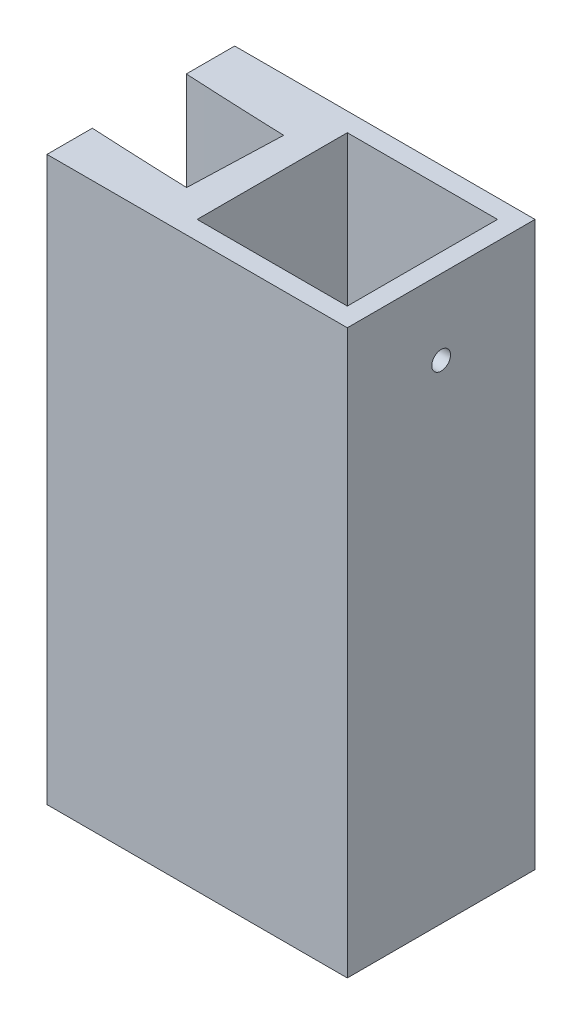
ISO-10303-21;
HEADER;
FILE_DESCRIPTION(('STEP AP214'),'2;1');
FILE_NAME('part.step','',(''),(''),'','','');
FILE_SCHEMA(('AUTOMOTIVE_DESIGN { 1 0 10303 214 1 1 1 1 }'));
ENDSEC;
DATA;
#1=APPLICATION_CONTEXT('core data for automotive mechanical design processes');
#2=APPLICATION_PROTOCOL_DEFINITION('international standard','automotive_design',2000,#1);
#3=PRODUCT_CONTEXT('',#1,'mechanical');
#4=PRODUCT('Part','Part','',(#3));
#5=PRODUCT_RELATED_PRODUCT_CATEGORY('part','',(#4));
#6=PRODUCT_DEFINITION_FORMATION('','',#4);
#7=PRODUCT_DEFINITION_CONTEXT('part definition',#1,'design');
#8=PRODUCT_DEFINITION('design','',#6,#7);
#9=PRODUCT_DEFINITION_SHAPE('','',#8);
#10=(LENGTH_UNIT() NAMED_UNIT(*) SI_UNIT(.MILLI.,.METRE.));
#11=(NAMED_UNIT(*) PLANE_ANGLE_UNIT() SI_UNIT($,.RADIAN.));
#12=(NAMED_UNIT(*) SI_UNIT($,.STERADIAN.) SOLID_ANGLE_UNIT());
#13=UNCERTAINTY_MEASURE_WITH_UNIT(LENGTH_MEASURE(1.E-05),#10,'distance_accuracy_value','');
#14=(GEOMETRIC_REPRESENTATION_CONTEXT(3) GLOBAL_UNCERTAINTY_ASSIGNED_CONTEXT((#13)) GLOBAL_UNIT_ASSIGNED_CONTEXT((#10,
#11,#12)) REPRESENTATION_CONTEXT('',''));
#15=CARTESIAN_POINT('',(0.,0.,0.));
#16=DIRECTION('',(0.,0.,1.));
#17=DIRECTION('',(1.,0.,0.));
#18=AXIS2_PLACEMENT_3D('',#15,#16,#17);
#19=CARTESIAN_POINT('',(-55.,150.,0.));
#20=DIRECTION('',(1.,0.,0.));
#21=DIRECTION('',(0.,0.,-1.));
#22=AXIS2_PLACEMENT_3D('',#19,#20,#21);
#23=PLANE('',#22);
#24=DIRECTION('',(0.,0.,1.));
#25=VECTOR('',#24,1.);
#26=CARTESIAN_POINT('',(-55.,0.,0.));
#27=LINE('',#26,#25);
#28=CARTESIAN_POINT('',(-55.,0.,-25.));
#29=VERTEX_POINT('',#28);
#30=CARTESIAN_POINT('',(-55.,0.,-12.1136856987565));
#31=VERTEX_POINT('',#30);
#32=EDGE_CURVE('E134',#29,#31,#27,.T.);
#33=ORIENTED_EDGE('',*,*,#32,.T.);
#34=DIRECTION('',(0.,1.,0.));
#35=VECTOR('',#34,1.);
#36=CARTESIAN_POINT('',(-55.,-0.001000000000001,-12.1136856987565));
#37=LINE('',#36,#35);
#38=CARTESIAN_POINT('',(-55.,150.,-12.1136856987565));
#39=VERTEX_POINT('',#38);
#40=EDGE_CURVE('E141',#31,#39,#37,.T.);
#41=ORIENTED_EDGE('',*,*,#40,.T.);
#42=DIRECTION('',(0.,0.,1.));
#43=VECTOR('',#42,1.);
#44=CARTESIAN_POINT('',(-55.,150.,0.));
#45=LINE('',#44,#43);
#46=CARTESIAN_POINT('',(-55.,150.,-25.));
#47=VERTEX_POINT('',#46);
#48=EDGE_CURVE('E166',#47,#39,#45,.T.);
#49=ORIENTED_EDGE('',*,*,#48,.F.);
#50=DIRECTION('',(0.,-1.,0.));
#51=VECTOR('',#50,1.);
#52=CARTESIAN_POINT('',(-55.,150.,-25.));
#53=LINE('',#52,#51);
#54=EDGE_CURVE('E152',#47,#29,#53,.T.);
#55=ORIENTED_EDGE('',*,*,#54,.T.);
#56=EDGE_LOOP('',(#33,#41,#49,#55));
#57=FACE_BOUND('',#56,.T.);
#58=ADVANCED_FACE('F39',(#57),#23,.F.);
#59=CARTESIAN_POINT('',(0.,150.,25.));
#60=DIRECTION('',(0.,0.,1.));
#61=DIRECTION('',(1.,0.,0.));
#62=AXIS2_PLACEMENT_3D('',#59,#60,#61);
#63=PLANE('',#62);
#64=DIRECTION('',(-1.,0.,0.));
#65=VECTOR('',#64,1.);
#66=CARTESIAN_POINT('',(0.,0.,25.));
#67=LINE('',#66,#65);
#68=CARTESIAN_POINT('',(25.,0.,25.));
#69=VERTEX_POINT('',#68);
#70=CARTESIAN_POINT('',(-55.,0.,25.));
#71=VERTEX_POINT('',#70);
#72=EDGE_CURVE('E180',#69,#71,#67,.T.);
#73=ORIENTED_EDGE('',*,*,#72,.F.);
#74=DIRECTION('',(0.,-1.,0.));
#75=VECTOR('',#74,1.);
#76=CARTESIAN_POINT('',(25.,150.,25.));
#77=LINE('',#76,#75);
#78=CARTESIAN_POINT('',(25.,150.,25.));
#79=VERTEX_POINT('',#78);
#80=EDGE_CURVE('E11',#79,#69,#77,.T.);
#81=ORIENTED_EDGE('',*,*,#80,.F.);
#82=DIRECTION('',(-1.,0.,0.));
#83=VECTOR('',#82,1.);
#84=CARTESIAN_POINT('',(0.,150.,25.));
#85=LINE('',#84,#83);
#86=CARTESIAN_POINT('',(-55.,150.,25.));
#87=VERTEX_POINT('',#86);
#88=EDGE_CURVE('E153',#79,#87,#85,.T.);
#89=ORIENTED_EDGE('',*,*,#88,.T.);
#90=DIRECTION('',(0.,-1.,0.));
#91=VECTOR('',#90,1.);
#92=CARTESIAN_POINT('',(-55.,150.,25.));
#93=LINE('',#92,#91);
#94=EDGE_CURVE('E163',#87,#71,#93,.T.);
#95=ORIENTED_EDGE('',*,*,#94,.T.);
#96=EDGE_LOOP('',(#73,#81,#89,#95));
#97=FACE_BOUND('',#96,.T.);
#98=ADVANCED_FACE('F41',(#97),#63,.T.);
#99=CARTESIAN_POINT('',(25.,150.,0.));
#100=DIRECTION('',(1.,0.,0.));
#101=DIRECTION('',(0.,0.,-1.));
#102=AXIS2_PLACEMENT_3D('',#99,#100,#101);
#103=PLANE('',#102);
#104=CARTESIAN_POINT('',(25.,130.,0.));
#105=DIRECTION('',(1.,0.,0.));
#106=DIRECTION('',(0.,0.,-1.));
#107=AXIS2_PLACEMENT_3D('',#104,#105,#106);
#108=CIRCLE('',#107,2.5);
#109=CARTESIAN_POINT('',(25.,130.,-2.50000000000001));
#110=VERTEX_POINT('',#109);
#111=EDGE_CURVE('E226',#110,#110,#108,.T.);
#112=ORIENTED_EDGE('',*,*,#111,.F.);
#113=EDGE_LOOP('',(#112));
#114=FACE_BOUND('',#113,.T.);
#115=DIRECTION('',(0.,0.,1.));
#116=VECTOR('',#115,1.);
#117=CARTESIAN_POINT('',(25.,0.,0.));
#118=LINE('',#117,#116);
#119=CARTESIAN_POINT('',(25.,0.,-25.));
#120=VERTEX_POINT('',#119);
#121=EDGE_CURVE('E175',#120,#69,#118,.T.);
#122=ORIENTED_EDGE('',*,*,#121,.F.);
#123=DIRECTION('',(0.,-1.,0.));
#124=VECTOR('',#123,1.);
#125=CARTESIAN_POINT('',(25.,150.,-25.));
#126=LINE('',#125,#124);
#127=CARTESIAN_POINT('',(25.,150.,-25.));
#128=VERTEX_POINT('',#127);
#129=EDGE_CURVE('E47',#128,#120,#126,.T.);
#130=ORIENTED_EDGE('',*,*,#129,.F.);
#131=DIRECTION('',(0.,0.,1.));
#132=VECTOR('',#131,1.);
#133=CARTESIAN_POINT('',(25.,150.,0.));
#134=LINE('',#133,#132);
#135=EDGE_CURVE('E157',#128,#79,#134,.T.);
#136=ORIENTED_EDGE('',*,*,#135,.T.);
#137=ORIENTED_EDGE('',*,*,#80,.T.);
#138=EDGE_LOOP('',(#122,#130,#136,#137));
#139=FACE_BOUND('',#138,.T.);
#140=ADVANCED_FACE('F176',(#114,#139),#103,.T.);
#141=CARTESIAN_POINT('',(0.,150.,-25.));
#142=DIRECTION('',(0.,0.,1.));
#143=DIRECTION('',(1.,0.,0.));
#144=AXIS2_PLACEMENT_3D('',#141,#142,#143);
#145=PLANE('',#144);
#146=DIRECTION('',(-1.,0.,0.));
#147=VECTOR('',#146,1.);
#148=CARTESIAN_POINT('',(0.,0.,-25.));
#149=LINE('',#148,#147);
#150=EDGE_CURVE('E159',#120,#29,#149,.T.);
#151=ORIENTED_EDGE('',*,*,#150,.T.);
#152=ORIENTED_EDGE('',*,*,#54,.F.);
#153=DIRECTION('',(-1.,0.,0.));
#154=VECTOR('',#153,1.);
#155=CARTESIAN_POINT('',(0.,150.,-25.));
#156=LINE('',#155,#154);
#157=EDGE_CURVE('E172',#128,#47,#156,.T.);
#158=ORIENTED_EDGE('',*,*,#157,.F.);
#159=ORIENTED_EDGE('',*,*,#129,.T.);
#160=EDGE_LOOP('',(#151,#152,#158,#159));
#161=FACE_BOUND('',#160,.T.);
#162=ADVANCED_FACE('F171',(#161),#145,.F.);
#163=CARTESIAN_POINT('',(-55.0000000000003,150.,12.9206741571568));
#164=VERTEX_POINT('',#163);
#165=EDGE_CURVE('E185',#164,#87,#45,.T.);
#166=ORIENTED_EDGE('',*,*,#165,.F.);
#167=DIRECTION('',(0.,1.,0.));
#168=VECTOR('',#167,1.);
#169=CARTESIAN_POINT('',(-55.0000000000003,-0.001000000000001,12.9206741571568));
#170=LINE('',#169,#168);
#171=CARTESIAN_POINT('',(-55.0000000000003,0.,12.9206741571568));
#172=VERTEX_POINT('',#171);
#173=EDGE_CURVE('E147',#172,#164,#170,.T.);
#174=ORIENTED_EDGE('',*,*,#173,.F.);
#175=EDGE_CURVE('E154',#172,#71,#27,.T.);
#176=ORIENTED_EDGE('',*,*,#175,.T.);
#177=ORIENTED_EDGE('',*,*,#94,.F.);
#178=EDGE_LOOP('',(#166,#174,#176,#177));
#179=FACE_BOUND('',#178,.T.);
#180=ADVANCED_FACE('F247',(#179),#23,.F.);
#181=CARTESIAN_POINT('',(0.,150.,0.));
#182=DIRECTION('',(0.,1.,0.));
#183=DIRECTION('',(0.,0.,1.));
#184=AXIS2_PLACEMENT_3D('',#181,#182,#183);
#185=PLANE('',#184);
#186=CARTESIAN_POINT('',(24.999999999988,150.,-1525.));
#187=DIRECTION('',(0.,-1.,0.));
#188=DIRECTION('',(0.,0.,1.));
#189=AXIS2_PLACEMENT_3D('',#186,#187,#188);
#190=CIRCLE('',#189,1515.);
#191=CARTESIAN_POINT('',(-27.8727375043363,150.,-10.9228970660713));
#192=VERTEX_POINT('',#191);
#193=EDGE_CURVE('E138',#192,#39,#190,.T.);
#194=ORIENTED_EDGE('',*,*,#193,.F.);
#195=DIRECTION('',(0.0348994967025245,0.,-0.999390827019095));
#196=VECTOR('',#195,1.);
#197=CARTESIAN_POINT('',(-28.7452249218995,150.,14.0618736094071));
#198=LINE('',#197,#196);
#199=CARTESIAN_POINT('',(-28.7452249218995,150.,14.0618736094071));
#200=VERTEX_POINT('',#199);
#201=EDGE_CURVE('E148',#200,#192,#198,.T.);
#202=ORIENTED_EDGE('',*,*,#201,.F.);
#203=CARTESIAN_POINT('',(24.999999999988,150.,-1525.));
#204=DIRECTION('',(0.,1.,0.));
#205=DIRECTION('',(0.,0.,1.));
#206=AXIS2_PLACEMENT_3D('',#203,#204,#205);
#207=CIRCLE('',#206,1540.);
#208=EDGE_CURVE('E236',#164,#200,#207,.T.);
#209=ORIENTED_EDGE('',*,*,#208,.F.);
#210=ORIENTED_EDGE('',*,*,#165,.T.);
#211=ORIENTED_EDGE('',*,*,#88,.F.);
#212=ORIENTED_EDGE('',*,*,#135,.F.);
#213=ORIENTED_EDGE('',*,*,#157,.T.);
#214=ORIENTED_EDGE('',*,*,#48,.T.);
#215=EDGE_LOOP('',(#194,#202,#209,#210,#211,#212,#213,#214));
#216=FACE_BOUND('',#215,.T.);
#217=DIRECTION('',(0.,0.,-1.));
#218=VECTOR('',#217,1.);
#219=CARTESIAN_POINT('',(20.,150.,-20.));
#220=LINE('',#219,#218);
#221=CARTESIAN_POINT('',(20.,150.,20.));
#222=VERTEX_POINT('',#221);
#223=CARTESIAN_POINT('',(20.,150.,-20.));
#224=VERTEX_POINT('',#223);
#225=EDGE_CURVE('E213',#222,#224,#220,.T.);
#226=ORIENTED_EDGE('',*,*,#225,.F.);
#227=DIRECTION('',(1.,0.,0.));
#228=VECTOR('',#227,1.);
#229=CARTESIAN_POINT('',(-20.,150.,20.));
#230=LINE('',#229,#228);
#231=CARTESIAN_POINT('',(-20.,150.,20.));
#232=VERTEX_POINT('',#231);
#233=EDGE_CURVE('E204',#232,#222,#230,.T.);
#234=ORIENTED_EDGE('',*,*,#233,.F.);
#235=DIRECTION('',(0.,0.,1.));
#236=VECTOR('',#235,1.);
#237=CARTESIAN_POINT('',(-20.,150.,-20.));
#238=LINE('',#237,#236);
#239=CARTESIAN_POINT('',(-20.,150.,-20.));
#240=VERTEX_POINT('',#239);
#241=EDGE_CURVE('E208',#240,#232,#238,.T.);
#242=ORIENTED_EDGE('',*,*,#241,.F.);
#243=DIRECTION('',(-1.,0.,0.));
#244=VECTOR('',#243,1.);
#245=CARTESIAN_POINT('',(-20.,150.,-20.));
#246=LINE('',#245,#244);
#247=EDGE_CURVE('E211',#224,#240,#246,.T.);
#248=ORIENTED_EDGE('',*,*,#247,.F.);
#249=EDGE_LOOP('',(#226,#234,#242,#248));
#250=FACE_BOUND('',#249,.T.);
#251=ADVANCED_FACE('F250',(#216,#250),#185,.T.);
#252=CARTESIAN_POINT('',(0.,0.,0.));
#253=DIRECTION('',(0.,1.,0.));
#254=DIRECTION('',(0.,0.,1.));
#255=AXIS2_PLACEMENT_3D('',#252,#253,#254);
#256=PLANE('',#255);
#257=CARTESIAN_POINT('',(0.,0.,0.));
#258=DIRECTION('',(0.,-1.,0.));
#259=DIRECTION('',(0.,0.,-1.));
#260=AXIS2_PLACEMENT_3D('',#257,#258,#259);
#261=CIRCLE('',#260,13.6824088833462);
#262=CARTESIAN_POINT('',(0.,0.,-13.6824088833462));
#263=VERTEX_POINT('',#262);
#264=EDGE_CURVE('E193',#263,#263,#261,.T.);
#265=ORIENTED_EDGE('',*,*,#264,.F.);
#266=EDGE_LOOP('',(#265));
#267=FACE_BOUND('',#266,.T.);
#268=DIRECTION('',(-0.0348994967025245,0.,0.999390827019095));
#269=VECTOR('',#268,1.);
#270=CARTESIAN_POINT('',(-28.7452249218995,0.,14.0618736094071));
#271=LINE('',#270,#269);
#272=CARTESIAN_POINT('',(-27.8727375043363,0.,-10.9228970660713));
#273=VERTEX_POINT('',#272);
#274=CARTESIAN_POINT('',(-28.7452249218995,0.,14.0618736094067));
#275=VERTEX_POINT('',#274);
#276=EDGE_CURVE('E136',#273,#275,#271,.T.);
#277=ORIENTED_EDGE('',*,*,#276,.F.);
#278=CARTESIAN_POINT('',(24.999999999988,0.,-1525.));
#279=DIRECTION('',(0.,1.,0.));
#280=DIRECTION('',(0.,0.,1.));
#281=AXIS2_PLACEMENT_3D('',#278,#279,#280);
#282=CIRCLE('',#281,1515.);
#283=EDGE_CURVE('E130',#31,#273,#282,.T.);
#284=ORIENTED_EDGE('',*,*,#283,.F.);
#285=ORIENTED_EDGE('',*,*,#32,.F.);
#286=ORIENTED_EDGE('',*,*,#150,.F.);
#287=ORIENTED_EDGE('',*,*,#121,.T.);
#288=ORIENTED_EDGE('',*,*,#72,.T.);
#289=ORIENTED_EDGE('',*,*,#175,.F.);
#290=CARTESIAN_POINT('',(24.999999999988,0.,-1525.));
#291=DIRECTION('',(0.,1.,0.));
#292=DIRECTION('',(0.,0.,1.));
#293=AXIS2_PLACEMENT_3D('',#290,#291,#292);
#294=CIRCLE('',#293,1540.);
#295=EDGE_CURVE('E240',#275,#172,#294,.F.);
#296=ORIENTED_EDGE('',*,*,#295,.F.);
#297=EDGE_LOOP('',(#277,#284,#285,#286,#287,#288,#289,#296));
#298=FACE_BOUND('',#297,.T.);
#299=ADVANCED_FACE('F132',(#267,#298),#256,.F.);
#300=CARTESIAN_POINT('',(0.,100.,0.));
#301=DIRECTION('',(0.,-1.,0.));
#302=DIRECTION('',(0.,0.,-1.));
#303=AXIS2_PLACEMENT_3D('',#300,#301,#302);
#304=PLANE('',#303);
#305=CARTESIAN_POINT('',(0.,100.,0.));
#306=DIRECTION('',(0.,-1.,0.));
#307=DIRECTION('',(0.,0.,-1.));
#308=AXIS2_PLACEMENT_3D('',#305,#306,#307);
#309=CIRCLE('',#308,5.);
#310=CARTESIAN_POINT('',(0.,100.,-5.));
#311=VERTEX_POINT('',#310);
#312=EDGE_CURVE('E181',#311,#311,#309,.T.);
#313=ORIENTED_EDGE('',*,*,#312,.T.);
#314=EDGE_LOOP('',(#313));
#315=FACE_BOUND('',#314,.T.);
#316=ADVANCED_FACE('F319',(#315),#304,.T.);
#317=CARTESIAN_POINT('',(0.,100.,0.));
#318=DIRECTION('',(0.,-1.,0.));
#319=DIRECTION('',(0.,0.,-1.));
#320=AXIS2_PLACEMENT_3D('',#317,#318,#319);
#321=CONICAL_SURFACE('',#320,5.,0.174532925199426);
#322=CARTESIAN_POINT('',(0.,50.7596123493895,0.));
#323=DIRECTION('',(0.,-1.,0.));
#324=DIRECTION('',(0.,0.,-1.));
#325=AXIS2_PLACEMENT_3D('',#322,#323,#324);
#326=CIRCLE('',#325,13.6824088833462);
#327=CARTESIAN_POINT('',(0.,50.7596123493895,-13.6824088833462));
#328=VERTEX_POINT('',#327);
#329=EDGE_CURVE('E190',#328,#328,#326,.T.);
#330=ORIENTED_EDGE('',*,*,#329,.T.);
#331=EDGE_LOOP('',(#330));
#332=FACE_BOUND('',#331,.T.);
#333=ORIENTED_EDGE('',*,*,#312,.F.);
#334=EDGE_LOOP('',(#333));
#335=FACE_BOUND('',#334,.T.);
#336=ADVANCED_FACE('F315',(#332,#335),#321,.F.);
#337=CARTESIAN_POINT('',(0.,0.,0.));
#338=DIRECTION('',(0.,-1.,0.));
#339=DIRECTION('',(0.,0.,-1.));
#340=AXIS2_PLACEMENT_3D('',#337,#338,#339);
#341=CYLINDRICAL_SURFACE('',#340,13.6824088833462);
#342=ORIENTED_EDGE('',*,*,#264,.T.);
#343=EDGE_LOOP('',(#342));
#344=FACE_BOUND('',#343,.T.);
#345=ORIENTED_EDGE('',*,*,#329,.F.);
#346=EDGE_LOOP('',(#345));
#347=FACE_BOUND('',#346,.T.);
#348=ADVANCED_FACE('F311',(#344,#347),#341,.F.);
#349=CARTESIAN_POINT('',(20.,110.,-20.));
#350=DIRECTION('',(1.,0.,0.));
#351=DIRECTION('',(0.,0.,-1.));
#352=AXIS2_PLACEMENT_3D('',#349,#350,#351);
#353=PLANE('',#352);
#354=CARTESIAN_POINT('',(20.,130.,0.));
#355=DIRECTION('',(1.,0.,0.));
#356=DIRECTION('',(0.,0.,-1.));
#357=AXIS2_PLACEMENT_3D('',#354,#355,#356);
#358=CIRCLE('',#357,2.5);
#359=CARTESIAN_POINT('',(20.,130.,-2.5));
#360=VERTEX_POINT('',#359);
#361=EDGE_CURVE('E216',#360,#360,#358,.T.);
#362=ORIENTED_EDGE('',*,*,#361,.T.);
#363=EDGE_LOOP('',(#362));
#364=FACE_BOUND('',#363,.T.);
#365=ORIENTED_EDGE('',*,*,#225,.T.);
#366=DIRECTION('',(0.,1.,0.));
#367=VECTOR('',#366,1.);
#368=CARTESIAN_POINT('',(20.,110.,-20.));
#369=LINE('',#368,#367);
#370=CARTESIAN_POINT('',(20.,110.,-20.));
#371=VERTEX_POINT('',#370);
#372=EDGE_CURVE('E62',#371,#224,#369,.T.);
#373=ORIENTED_EDGE('',*,*,#372,.F.);
#374=DIRECTION('',(0.,0.,-1.));
#375=VECTOR('',#374,1.);
#376=CARTESIAN_POINT('',(20.,110.,-20.));
#377=LINE('',#376,#375);
#378=CARTESIAN_POINT('',(20.,110.,20.));
#379=VERTEX_POINT('',#378);
#380=EDGE_CURVE('E207',#379,#371,#377,.T.);
#381=ORIENTED_EDGE('',*,*,#380,.F.);
#382=DIRECTION('',(0.,1.,0.));
#383=VECTOR('',#382,1.);
#384=CARTESIAN_POINT('',(20.,110.,20.));
#385=LINE('',#384,#383);
#386=EDGE_CURVE('E196',#379,#222,#385,.T.);
#387=ORIENTED_EDGE('',*,*,#386,.T.);
#388=EDGE_LOOP('',(#365,#373,#381,#387));
#389=FACE_BOUND('',#388,.T.);
#390=ADVANCED_FACE('F302',(#364,#389),#353,.F.);
#391=CARTESIAN_POINT('',(-20.,110.,20.));
#392=DIRECTION('',(0.,0.,1.));
#393=DIRECTION('',(1.,0.,0.));
#394=AXIS2_PLACEMENT_3D('',#391,#392,#393);
#395=PLANE('',#394);
#396=ORIENTED_EDGE('',*,*,#233,.T.);
#397=ORIENTED_EDGE('',*,*,#386,.F.);
#398=DIRECTION('',(1.,0.,0.));
#399=VECTOR('',#398,1.);
#400=CARTESIAN_POINT('',(-20.,110.,20.));
#401=LINE('',#400,#399);
#402=CARTESIAN_POINT('',(-20.,110.,20.));
#403=VERTEX_POINT('',#402);
#404=EDGE_CURVE('E199',#403,#379,#401,.T.);
#405=ORIENTED_EDGE('',*,*,#404,.F.);
#406=DIRECTION('',(0.,1.,0.));
#407=VECTOR('',#406,1.);
#408=CARTESIAN_POINT('',(-20.,110.,20.));
#409=LINE('',#408,#407);
#410=EDGE_CURVE('E201',#403,#232,#409,.T.);
#411=ORIENTED_EDGE('',*,*,#410,.T.);
#412=EDGE_LOOP('',(#396,#397,#405,#411));
#413=FACE_BOUND('',#412,.T.);
#414=ADVANCED_FACE('F298',(#413),#395,.F.);
#415=CARTESIAN_POINT('',(-20.,110.,-20.));
#416=DIRECTION('',(-1.,0.,0.));
#417=DIRECTION('',(0.,0.,1.));
#418=AXIS2_PLACEMENT_3D('',#415,#416,#417);
#419=PLANE('',#418);
#420=ORIENTED_EDGE('',*,*,#241,.T.);
#421=ORIENTED_EDGE('',*,*,#410,.F.);
#422=DIRECTION('',(0.,0.,1.));
#423=VECTOR('',#422,1.);
#424=CARTESIAN_POINT('',(-20.,110.,-20.));
#425=LINE('',#424,#423);
#426=CARTESIAN_POINT('',(-20.,110.,-20.));
#427=VERTEX_POINT('',#426);
#428=EDGE_CURVE('E218',#427,#403,#425,.T.);
#429=ORIENTED_EDGE('',*,*,#428,.F.);
#430=DIRECTION('',(0.,1.,0.));
#431=VECTOR('',#430,1.);
#432=CARTESIAN_POINT('',(-20.,110.,-20.));
#433=LINE('',#432,#431);
#434=EDGE_CURVE('E198',#427,#240,#433,.T.);
#435=ORIENTED_EDGE('',*,*,#434,.T.);
#436=EDGE_LOOP('',(#420,#421,#429,#435));
#437=FACE_BOUND('',#436,.T.);
#438=ADVANCED_FACE('F301',(#437),#419,.F.);
#439=CARTESIAN_POINT('',(-20.,110.,-20.));
#440=DIRECTION('',(0.,0.,-1.));
#441=DIRECTION('',(-1.,0.,0.));
#442=AXIS2_PLACEMENT_3D('',#439,#440,#441);
#443=PLANE('',#442);
#444=ORIENTED_EDGE('',*,*,#247,.T.);
#445=ORIENTED_EDGE('',*,*,#434,.F.);
#446=DIRECTION('',(-1.,0.,0.));
#447=VECTOR('',#446,1.);
#448=CARTESIAN_POINT('',(-20.,110.,-20.));
#449=LINE('',#448,#447);
#450=EDGE_CURVE('E220',#371,#427,#449,.T.);
#451=ORIENTED_EDGE('',*,*,#450,.F.);
#452=ORIENTED_EDGE('',*,*,#372,.T.);
#453=EDGE_LOOP('',(#444,#445,#451,#452));
#454=FACE_BOUND('',#453,.T.);
#455=ADVANCED_FACE('F293',(#454),#443,.F.);
#456=CARTESIAN_POINT('',(0.,110.,0.));
#457=DIRECTION('',(0.,1.,0.));
#458=DIRECTION('',(0.,0.,1.));
#459=AXIS2_PLACEMENT_3D('',#456,#457,#458);
#460=PLANE('',#459);
#461=ORIENTED_EDGE('',*,*,#380,.T.);
#462=ORIENTED_EDGE('',*,*,#450,.T.);
#463=ORIENTED_EDGE('',*,*,#428,.T.);
#464=ORIENTED_EDGE('',*,*,#404,.T.);
#465=EDGE_LOOP('',(#461,#462,#463,#464));
#466=FACE_BOUND('',#465,.T.);
#467=ADVANCED_FACE('F287',(#466),#460,.T.);
#468=CARTESIAN_POINT('',(25.,130.,0.));
#469=DIRECTION('',(1.,0.,0.));
#470=DIRECTION('',(0.,0.,-1.));
#471=AXIS2_PLACEMENT_3D('',#468,#469,#470);
#472=CYLINDRICAL_SURFACE('',#471,2.5);
#473=ORIENTED_EDGE('',*,*,#361,.F.);
#474=EDGE_LOOP('',(#473));
#475=FACE_BOUND('',#474,.T.);
#476=ORIENTED_EDGE('',*,*,#111,.T.);
#477=EDGE_LOOP('',(#476));
#478=FACE_BOUND('',#477,.T.);
#479=ADVANCED_FACE('F262',(#475,#478),#472,.F.);
#480=CARTESIAN_POINT('',(24.999999999988,-0.001000000000001,-1525.));
#481=DIRECTION('',(0.,1.,0.));
#482=DIRECTION('',(0.,0.,1.));
#483=AXIS2_PLACEMENT_3D('',#480,#481,#482);
#484=CYLINDRICAL_SURFACE('',#483,1515.);
#485=ORIENTED_EDGE('',*,*,#283,.T.);
#486=DIRECTION('',(0.,1.,0.));
#487=VECTOR('',#486,1.);
#488=CARTESIAN_POINT('',(-27.8727375043363,-0.001000000000001,-10.9228970660713));
#489=LINE('',#488,#487);
#490=EDGE_CURVE('E228',#273,#192,#489,.T.);
#491=ORIENTED_EDGE('',*,*,#490,.T.);
#492=ORIENTED_EDGE('',*,*,#193,.T.);
#493=ORIENTED_EDGE('',*,*,#40,.F.);
#494=EDGE_LOOP('',(#485,#491,#492,#493));
#495=FACE_BOUND('',#494,.T.);
#496=ADVANCED_FACE('F142',(#495),#484,.T.);
#497=CARTESIAN_POINT('',(-28.7452249218995,-0.001000000000001,14.0618736094071));
#498=DIRECTION('',(0.999390827019095,0.,0.0348994967025245));
#499=DIRECTION('',(0.0348994967025245,0.,-0.999390827019095));
#500=AXIS2_PLACEMENT_3D('',#497,#498,#499);
#501=PLANE('',#500);
#502=ORIENTED_EDGE('',*,*,#276,.T.);
#503=DIRECTION('',(0.,1.,0.));
#504=VECTOR('',#503,1.);
#505=CARTESIAN_POINT('',(-28.7452249218995,-0.001000000000001,14.0618736094071));
#506=LINE('',#505,#504);
#507=EDGE_CURVE('E54',#275,#200,#506,.T.);
#508=ORIENTED_EDGE('',*,*,#507,.T.);
#509=ORIENTED_EDGE('',*,*,#201,.T.);
#510=ORIENTED_EDGE('',*,*,#490,.F.);
#511=EDGE_LOOP('',(#502,#508,#509,#510));
#512=FACE_BOUND('',#511,.T.);
#513=ADVANCED_FACE('F254',(#512),#501,.F.);
#514=CARTESIAN_POINT('',(24.999999999988,-0.001000000000001,-1525.));
#515=DIRECTION('',(0.,1.,0.));
#516=DIRECTION('',(0.,0.,1.));
#517=AXIS2_PLACEMENT_3D('',#514,#515,#516);
#518=CYLINDRICAL_SURFACE('',#517,1540.);
#519=ORIENTED_EDGE('',*,*,#295,.T.);
#520=ORIENTED_EDGE('',*,*,#173,.T.);
#521=ORIENTED_EDGE('',*,*,#208,.T.);
#522=ORIENTED_EDGE('',*,*,#507,.F.);
#523=EDGE_LOOP('',(#519,#520,#521,#522));
#524=FACE_BOUND('',#523,.T.);
#525=ADVANCED_FACE('F242',(#524),#518,.F.);
#526=CLOSED_SHELL('',(#58,#98,#140,#162,#180,#251,#299,#316,#336,#348,#390,#414,#438,#455,#467,
#479,#496,#513,#525));
#527=MANIFOLD_SOLID_BREP('B2',#526);
#528=ADVANCED_BREP_SHAPE_REPRESENTATION('',(#18,#527),#14);
#529=SHAPE_DEFINITION_REPRESENTATION(#9,#528);
ENDSEC;
END-ISO-10303-21;
